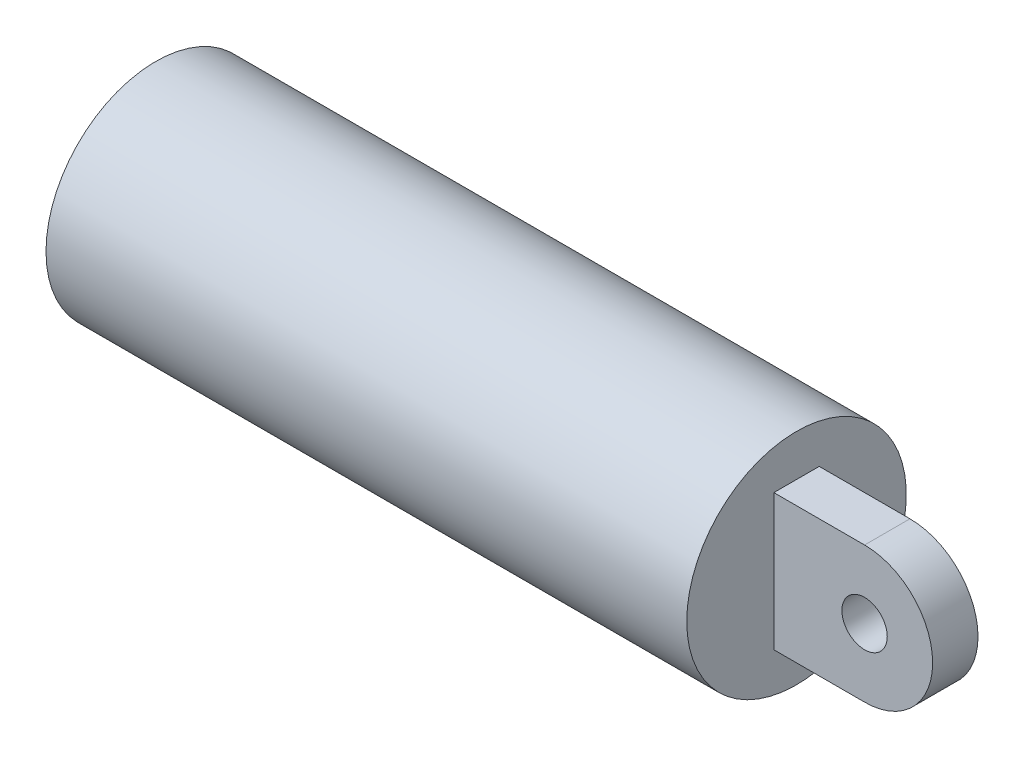
ISO-10303-21;
HEADER;
FILE_DESCRIPTION(('STEP AP214'),'2;1');
FILE_NAME('part.step','',(''),(''),'','','');
FILE_SCHEMA(('AUTOMOTIVE_DESIGN { 1 0 10303 214 1 1 1 1 }'));
ENDSEC;
DATA;
#1=APPLICATION_CONTEXT('core data for automotive mechanical design processes');
#2=APPLICATION_PROTOCOL_DEFINITION('international standard','automotive_design',2000,#1);
#3=PRODUCT_CONTEXT('',#1,'mechanical');
#4=PRODUCT('Part','Part','',(#3));
#5=PRODUCT_RELATED_PRODUCT_CATEGORY('part','',(#4));
#6=PRODUCT_DEFINITION_FORMATION('','',#4);
#7=PRODUCT_DEFINITION_CONTEXT('part definition',#1,'design');
#8=PRODUCT_DEFINITION('design','',#6,#7);
#9=PRODUCT_DEFINITION_SHAPE('','',#8);
#10=(LENGTH_UNIT() NAMED_UNIT(*) SI_UNIT(.MILLI.,.METRE.));
#11=(NAMED_UNIT(*) PLANE_ANGLE_UNIT() SI_UNIT($,.RADIAN.));
#12=(NAMED_UNIT(*) SI_UNIT($,.STERADIAN.) SOLID_ANGLE_UNIT());
#13=UNCERTAINTY_MEASURE_WITH_UNIT(LENGTH_MEASURE(1.E-05),#10,'distance_accuracy_value','');
#14=(GEOMETRIC_REPRESENTATION_CONTEXT(3) GLOBAL_UNCERTAINTY_ASSIGNED_CONTEXT((#13)) GLOBAL_UNIT_ASSIGNED_CONTEXT((#10,
#11,#12)) REPRESENTATION_CONTEXT('',''));
#15=CARTESIAN_POINT('',(0.,0.,0.));
#16=DIRECTION('',(0.,0.,1.));
#17=DIRECTION('',(1.,0.,0.));
#18=AXIS2_PLACEMENT_3D('',#15,#16,#17);
#19=CARTESIAN_POINT('',(320.,24.,5.));
#20=DIRECTION('',(0.,0.,1.));
#21=DIRECTION('',(1.,0.,0.));
#22=AXIS2_PLACEMENT_3D('',#19,#20,#21);
#23=PLANE('',#22);
#24=CARTESIAN_POINT('',(320.,24.,5.));
#25=DIRECTION('',(0.,0.,1.));
#26=DIRECTION('',(1.,0.,0.));
#27=AXIS2_PLACEMENT_3D('',#24,#25,#26);
#28=CIRCLE('',#27,15.);
#29=CARTESIAN_POINT('',(320.,8.99999999999995,5.));
#30=VERTEX_POINT('',#29);
#31=CARTESIAN_POINT('',(320.,39.,5.));
#32=VERTEX_POINT('',#31);
#33=EDGE_CURVE('E102',#30,#32,#28,.T.);
#34=ORIENTED_EDGE('',*,*,#33,.T.);
#35=DIRECTION('',(-1.,0.,0.));
#36=VECTOR('',#35,1.);
#37=CARTESIAN_POINT('',(320.,39.,5.));
#38=LINE('',#37,#36);
#39=CARTESIAN_POINT('',(300.,39.,5.));
#40=VERTEX_POINT('',#39);
#41=EDGE_CURVE('E76',#32,#40,#38,.T.);
#42=ORIENTED_EDGE('',*,*,#41,.T.);
#43=DIRECTION('',(0.,-1.,0.));
#44=VECTOR('',#43,1.);
#45=CARTESIAN_POINT('',(300.,39.,5.));
#46=LINE('',#45,#44);
#47=CARTESIAN_POINT('',(300.,9.,5.));
#48=VERTEX_POINT('',#47);
#49=EDGE_CURVE('E97',#40,#48,#46,.T.);
#50=ORIENTED_EDGE('',*,*,#49,.T.);
#51=DIRECTION('',(1.,0.,0.));
#52=VECTOR('',#51,1.);
#53=CARTESIAN_POINT('',(300.,9.,5.));
#54=LINE('',#53,#52);
#55=EDGE_CURVE('E52',#48,#30,#54,.T.);
#56=ORIENTED_EDGE('',*,*,#55,.T.);
#57=EDGE_LOOP('',(#34,#42,#50,#56));
#58=FACE_BOUND('',#57,.T.);
#59=CARTESIAN_POINT('',(320.,24.,5.));
#60=DIRECTION('',(0.,0.,1.));
#61=DIRECTION('',(1.,0.,0.));
#62=AXIS2_PLACEMENT_3D('',#59,#60,#61);
#63=CIRCLE('',#62,5.0000000000001);
#64=CARTESIAN_POINT('',(325.,24.,5.));
#65=VERTEX_POINT('',#64);
#66=EDGE_CURVE('E105',#65,#65,#63,.T.);
#67=ORIENTED_EDGE('',*,*,#66,.F.);
#68=EDGE_LOOP('',(#67));
#69=FACE_BOUND('',#68,.T.);
#70=ADVANCED_FACE('F35',(#58,#69),#23,.T.);
#71=CARTESIAN_POINT('',(320.,24.,-5.));
#72=DIRECTION('',(0.,0.,1.));
#73=DIRECTION('',(1.,0.,0.));
#74=AXIS2_PLACEMENT_3D('',#71,#72,#73);
#75=PLANE('',#74);
#76=CARTESIAN_POINT('',(320.,24.,-5.));
#77=DIRECTION('',(0.,0.,1.));
#78=DIRECTION('',(1.,0.,0.));
#79=AXIS2_PLACEMENT_3D('',#76,#77,#78);
#80=CIRCLE('',#79,15.);
#81=CARTESIAN_POINT('',(320.,8.99999999999995,-5.));
#82=VERTEX_POINT('',#81);
#83=CARTESIAN_POINT('',(320.,39.,-5.));
#84=VERTEX_POINT('',#83);
#85=EDGE_CURVE('E94',#82,#84,#80,.T.);
#86=ORIENTED_EDGE('',*,*,#85,.F.);
#87=DIRECTION('',(1.,0.,0.));
#88=VECTOR('',#87,1.);
#89=CARTESIAN_POINT('',(300.,9.,-5.));
#90=LINE('',#89,#88);
#91=CARTESIAN_POINT('',(300.,9.,-5.));
#92=VERTEX_POINT('',#91);
#93=EDGE_CURVE('E69',#92,#82,#90,.T.);
#94=ORIENTED_EDGE('',*,*,#93,.F.);
#95=DIRECTION('',(0.,-1.,0.));
#96=VECTOR('',#95,1.);
#97=CARTESIAN_POINT('',(300.,39.,-5.));
#98=LINE('',#97,#96);
#99=CARTESIAN_POINT('',(300.,39.,-5.));
#100=VERTEX_POINT('',#99);
#101=EDGE_CURVE('E81',#100,#92,#98,.T.);
#102=ORIENTED_EDGE('',*,*,#101,.F.);
#103=DIRECTION('',(-1.,0.,0.));
#104=VECTOR('',#103,1.);
#105=CARTESIAN_POINT('',(320.,39.,-5.));
#106=LINE('',#105,#104);
#107=EDGE_CURVE('E86',#84,#100,#106,.T.);
#108=ORIENTED_EDGE('',*,*,#107,.F.);
#109=EDGE_LOOP('',(#86,#94,#102,#108));
#110=FACE_BOUND('',#109,.T.);
#111=CARTESIAN_POINT('',(320.,24.,-5.));
#112=DIRECTION('',(0.,0.,1.));
#113=DIRECTION('',(1.,0.,0.));
#114=AXIS2_PLACEMENT_3D('',#111,#112,#113);
#115=CIRCLE('',#114,5.0000000000001);
#116=CARTESIAN_POINT('',(325.,24.,-5.));
#117=VERTEX_POINT('',#116);
#118=EDGE_CURVE('E110',#117,#117,#115,.T.);
#119=ORIENTED_EDGE('',*,*,#118,.T.);
#120=EDGE_LOOP('',(#119));
#121=FACE_BOUND('',#120,.T.);
#122=ADVANCED_FACE('F84',(#110,#121),#75,.F.);
#123=CARTESIAN_POINT('',(320.,24.,5.));
#124=DIRECTION('',(0.,0.,-1.));
#125=DIRECTION('',(-1.,0.,0.));
#126=AXIS2_PLACEMENT_3D('',#123,#124,#125);
#127=CYLINDRICAL_SURFACE('',#126,15.);
#128=ORIENTED_EDGE('',*,*,#85,.T.);
#129=DIRECTION('',(0.,0.,-1.));
#130=VECTOR('',#129,1.);
#131=CARTESIAN_POINT('',(320.,39.,5.));
#132=LINE('',#131,#130);
#133=EDGE_CURVE('E11',#32,#84,#132,.T.);
#134=ORIENTED_EDGE('',*,*,#133,.F.);
#135=ORIENTED_EDGE('',*,*,#33,.F.);
#136=DIRECTION('',(0.,0.,-1.));
#137=VECTOR('',#136,1.);
#138=CARTESIAN_POINT('',(320.,8.99999999999995,5.));
#139=LINE('',#138,#137);
#140=EDGE_CURVE('E98',#30,#82,#139,.T.);
#141=ORIENTED_EDGE('',*,*,#140,.T.);
#142=EDGE_LOOP('',(#128,#134,#135,#141));
#143=FACE_BOUND('',#142,.T.);
#144=ADVANCED_FACE('F37',(#143),#127,.T.);
#145=CARTESIAN_POINT('',(320.,39.,5.));
#146=DIRECTION('',(0.,-1.,0.));
#147=DIRECTION('',(0.,0.,-1.));
#148=AXIS2_PLACEMENT_3D('',#145,#146,#147);
#149=PLANE('',#148);
#150=ORIENTED_EDGE('',*,*,#107,.T.);
#151=DIRECTION('',(0.,0.,-1.));
#152=VECTOR('',#151,1.);
#153=CARTESIAN_POINT('',(300.,39.,5.));
#154=LINE('',#153,#152);
#155=EDGE_CURVE('E44',#40,#100,#154,.T.);
#156=ORIENTED_EDGE('',*,*,#155,.F.);
#157=ORIENTED_EDGE('',*,*,#41,.F.);
#158=ORIENTED_EDGE('',*,*,#133,.T.);
#159=EDGE_LOOP('',(#150,#156,#157,#158));
#160=FACE_BOUND('',#159,.T.);
#161=ADVANCED_FACE('F90',(#160),#149,.F.);
#162=CARTESIAN_POINT('',(300.,9.,5.));
#163=DIRECTION('',(0.,1.,0.));
#164=DIRECTION('',(-1.,0.,0.));
#165=AXIS2_PLACEMENT_3D('',#162,#163,#164);
#166=PLANE('',#165);
#167=ORIENTED_EDGE('',*,*,#93,.T.);
#168=ORIENTED_EDGE('',*,*,#140,.F.);
#169=ORIENTED_EDGE('',*,*,#55,.F.);
#170=DIRECTION('',(0.,0.,-1.));
#171=VECTOR('',#170,1.);
#172=CARTESIAN_POINT('',(300.,9.,5.));
#173=LINE('',#172,#171);
#174=EDGE_CURVE('E66',#48,#92,#173,.T.);
#175=ORIENTED_EDGE('',*,*,#174,.T.);
#176=EDGE_LOOP('',(#167,#168,#169,#175));
#177=FACE_BOUND('',#176,.T.);
#178=ADVANCED_FACE('F154',(#177),#166,.F.);
#179=CARTESIAN_POINT('',(320.,24.,5.));
#180=DIRECTION('',(0.,0.,-1.));
#181=DIRECTION('',(-1.,0.,0.));
#182=AXIS2_PLACEMENT_3D('',#179,#180,#181);
#183=CYLINDRICAL_SURFACE('',#182,5.0000000000001);
#184=ORIENTED_EDGE('',*,*,#66,.T.);
#185=EDGE_LOOP('',(#184));
#186=FACE_BOUND('',#185,.T.);
#187=ORIENTED_EDGE('',*,*,#118,.F.);
#188=EDGE_LOOP('',(#187));
#189=FACE_BOUND('',#188,.T.);
#190=ADVANCED_FACE('F149',(#186,#189),#183,.F.);
#191=CARTESIAN_POINT('',(300.,39.,0.));
#192=DIRECTION('',(-1.,0.,0.));
#193=DIRECTION('',(0.,0.,1.));
#194=AXIS2_PLACEMENT_3D('',#191,#192,#193);
#195=PLANE('',#194);
#196=CARTESIAN_POINT('',(300.,24.,0.));
#197=DIRECTION('',(-1.,0.,0.));
#198=DIRECTION('',(0.,0.,1.));
#199=AXIS2_PLACEMENT_3D('',#196,#197,#198);
#200=CIRCLE('',#199,24.198468166319);
#201=CARTESIAN_POINT('',(300.,24.,24.198468166319));
#202=VERTEX_POINT('',#201);
#203=EDGE_CURVE('E113',#202,#202,#200,.T.);
#204=ORIENTED_EDGE('',*,*,#203,.F.);
#205=EDGE_LOOP('',(#204));
#206=FACE_BOUND('',#205,.T.);
#207=ORIENTED_EDGE('',*,*,#155,.T.);
#208=ORIENTED_EDGE('',*,*,#101,.T.);
#209=ORIENTED_EDGE('',*,*,#174,.F.);
#210=ORIENTED_EDGE('',*,*,#49,.F.);
#211=EDGE_LOOP('',(#207,#208,#209,#210));
#212=FACE_BOUND('',#211,.T.);
#213=ADVANCED_FACE('F96',(#206,#212),#195,.F.);
#214=CARTESIAN_POINT('',(289.025351804782,24.,0.));
#215=DIRECTION('',(-1.,0.,0.));
#216=DIRECTION('',(0.,0.,1.));
#217=AXIS2_PLACEMENT_3D('',#214,#215,#216);
#218=CYLINDRICAL_SURFACE('',#217,24.198468166319);
#219=CARTESIAN_POINT('',(158.764392761708,24.,0.));
#220=DIRECTION('',(-1.,0.,0.));
#221=DIRECTION('',(0.,0.,1.));
#222=AXIS2_PLACEMENT_3D('',#219,#220,#221);
#223=CIRCLE('',#222,24.198468166319);
#224=CARTESIAN_POINT('',(158.764392761708,24.,24.198468166319));
#225=VERTEX_POINT('',#224);
#226=EDGE_CURVE('E118',#225,#225,#223,.T.);
#227=ORIENTED_EDGE('',*,*,#226,.F.);
#228=EDGE_LOOP('',(#227));
#229=FACE_BOUND('',#228,.T.);
#230=ORIENTED_EDGE('',*,*,#203,.T.);
#231=EDGE_LOOP('',(#230));
#232=FACE_BOUND('',#231,.T.);
#233=ADVANCED_FACE('F139',(#229,#232),#218,.T.);
#234=CARTESIAN_POINT('',(158.764392761708,48.198468166319,0.));
#235=DIRECTION('',(1.,0.,0.));
#236=DIRECTION('',(0.,0.,-1.));
#237=AXIS2_PLACEMENT_3D('',#234,#235,#236);
#238=PLANE('',#237);
#239=CARTESIAN_POINT('',(158.764392761708,24.,0.));
#240=DIRECTION('',(-1.,0.,0.));
#241=DIRECTION('',(0.,0.,1.));
#242=AXIS2_PLACEMENT_3D('',#239,#240,#241);
#243=CIRCLE('',#242,15.);
#244=CARTESIAN_POINT('',(158.764392761708,24.,15.));
#245=VERTEX_POINT('',#244);
#246=EDGE_CURVE('E121',#245,#245,#243,.T.);
#247=ORIENTED_EDGE('',*,*,#246,.F.);
#248=EDGE_LOOP('',(#247));
#249=FACE_BOUND('',#248,.T.);
#250=ORIENTED_EDGE('',*,*,#226,.T.);
#251=EDGE_LOOP('',(#250));
#252=FACE_BOUND('',#251,.T.);
#253=ADVANCED_FACE('F133',(#249,#252),#238,.F.);
#254=CARTESIAN_POINT('',(289.025351804782,24.,0.));
#255=DIRECTION('',(-1.,0.,0.));
#256=DIRECTION('',(0.,0.,1.));
#257=AXIS2_PLACEMENT_3D('',#254,#255,#256);
#258=CYLINDRICAL_SURFACE('',#257,15.);
#259=CARTESIAN_POINT('',(289.025351804782,24.,0.));
#260=DIRECTION('',(-1.,0.,0.));
#261=DIRECTION('',(0.,0.,1.));
#262=AXIS2_PLACEMENT_3D('',#259,#260,#261);
#263=CIRCLE('',#262,15.);
#264=CARTESIAN_POINT('',(289.025351804782,24.,15.));
#265=VERTEX_POINT('',#264);
#266=EDGE_CURVE('E124',#265,#265,#263,.T.);
#267=ORIENTED_EDGE('',*,*,#266,.F.);
#268=EDGE_LOOP('',(#267));
#269=FACE_BOUND('',#268,.T.);
#270=ORIENTED_EDGE('',*,*,#246,.T.);
#271=EDGE_LOOP('',(#270));
#272=FACE_BOUND('',#271,.T.);
#273=ADVANCED_FACE('F130',(#269,#272),#258,.F.);
#274=CARTESIAN_POINT('',(289.025351804782,39.,0.));
#275=DIRECTION('',(1.,0.,0.));
#276=DIRECTION('',(0.,0.,-1.));
#277=AXIS2_PLACEMENT_3D('',#274,#275,#276);
#278=PLANE('',#277);
#279=ORIENTED_EDGE('',*,*,#266,.T.);
#280=EDGE_LOOP('',(#279));
#281=FACE_BOUND('',#280,.T.);
#282=ADVANCED_FACE('F128',(#281),#278,.F.);
#283=CLOSED_SHELL('',(#70,#122,#144,#161,#178,#190,#213,#233,#253,#273,#282));
#284=MANIFOLD_SOLID_BREP('B2',#283);
#285=ADVANCED_BREP_SHAPE_REPRESENTATION('',(#18,#284),#14);
#286=SHAPE_DEFINITION_REPRESENTATION(#9,#285);
ENDSEC;
END-ISO-10303-21;
